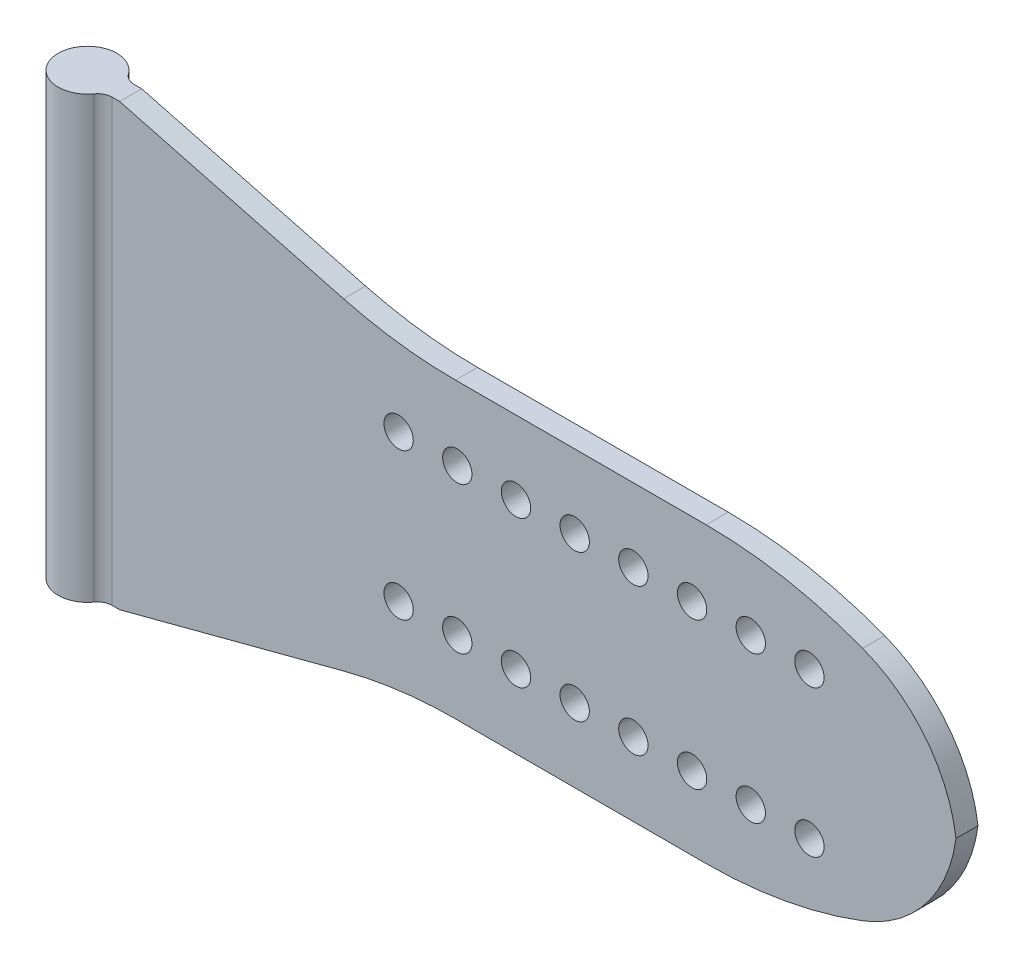
ISO-10303-21;
HEADER;
FILE_DESCRIPTION(('STEP AP214'),'2;1');
FILE_NAME('part.step','',(''),(''),'','','');
FILE_SCHEMA(('AUTOMOTIVE_DESIGN { 1 0 10303 214 1 1 1 1 }'));
ENDSEC;
DATA;
#1=APPLICATION_CONTEXT('core data for automotive mechanical design processes');
#2=APPLICATION_PROTOCOL_DEFINITION('international standard','automotive_design',2000,#1);
#3=PRODUCT_CONTEXT('',#1,'mechanical');
#4=PRODUCT('Part','Part','',(#3));
#5=PRODUCT_RELATED_PRODUCT_CATEGORY('part','',(#4));
#6=PRODUCT_DEFINITION_FORMATION('','',#4);
#7=PRODUCT_DEFINITION_CONTEXT('part definition',#1,'design');
#8=PRODUCT_DEFINITION('design','',#6,#7);
#9=PRODUCT_DEFINITION_SHAPE('','',#8);
#10=(LENGTH_UNIT() NAMED_UNIT(*) SI_UNIT(.MILLI.,.METRE.));
#11=(NAMED_UNIT(*) PLANE_ANGLE_UNIT() SI_UNIT($,.RADIAN.));
#12=(NAMED_UNIT(*) SI_UNIT($,.STERADIAN.) SOLID_ANGLE_UNIT());
#13=UNCERTAINTY_MEASURE_WITH_UNIT(LENGTH_MEASURE(1.E-05),#10,'distance_accuracy_value','');
#14=(GEOMETRIC_REPRESENTATION_CONTEXT(3) GLOBAL_UNCERTAINTY_ASSIGNED_CONTEXT((#13)) GLOBAL_UNIT_ASSIGNED_CONTEXT((#10,
#11,#12)) REPRESENTATION_CONTEXT('',''));
#15=CARTESIAN_POINT('',(0.,0.,0.));
#16=DIRECTION('',(0.,0.,1.));
#17=DIRECTION('',(1.,0.,0.));
#18=AXIS2_PLACEMENT_3D('',#15,#16,#17);
#19=CARTESIAN_POINT('',(0.,-15.,0.));
#20=DIRECTION('',(0.,1.,0.));
#21=DIRECTION('',(0.,0.,1.));
#22=AXIS2_PLACEMENT_3D('',#19,#20,#21);
#23=CYLINDRICAL_SURFACE('',#22,2.);
#24=DIRECTION('',(0.,1.,0.));
#25=VECTOR('',#24,1.);
#26=CARTESIAN_POINT('',(1.62446572413483,-15.,1.16666666666667));
#27=LINE('',#26,#25);
#28=CARTESIAN_POINT('',(1.62446572413483,-15.,1.16666666666667));
#29=VERTEX_POINT('',#28);
#30=CARTESIAN_POINT('',(1.62446572413483,15.,1.16666666666667));
#31=VERTEX_POINT('',#30);
#32=EDGE_CURVE('E198',#29,#31,#27,.T.);
#33=ORIENTED_EDGE('',*,*,#32,.T.);
#34=CARTESIAN_POINT('',(0.,15.,0.));
#35=DIRECTION('',(0.,1.,0.));
#36=DIRECTION('',(0.,0.,1.));
#37=AXIS2_PLACEMENT_3D('',#34,#35,#36);
#38=CIRCLE('',#37,2.);
#39=CARTESIAN_POINT('',(1.62446572413483,15.,-1.16666666666667));
#40=VERTEX_POINT('',#39);
#41=EDGE_CURVE('E178',#40,#31,#38,.T.);
#42=ORIENTED_EDGE('',*,*,#41,.F.);
#43=DIRECTION('',(0.,1.,0.));
#44=VECTOR('',#43,1.);
#45=CARTESIAN_POINT('',(1.62446572413483,-15.,-1.16666666666667));
#46=LINE('',#45,#44);
#47=CARTESIAN_POINT('',(1.62446572413483,-15.,-1.16666666666667));
#48=VERTEX_POINT('',#47);
#49=EDGE_CURVE('E156',#48,#40,#46,.T.);
#50=ORIENTED_EDGE('',*,*,#49,.F.);
#51=CARTESIAN_POINT('',(0.,-15.,0.));
#52=DIRECTION('',(0.,1.,0.));
#53=DIRECTION('',(0.,0.,1.));
#54=AXIS2_PLACEMENT_3D('',#51,#52,#53);
#55=CIRCLE('',#54,2.);
#56=EDGE_CURVE('E184',#48,#29,#55,.T.);
#57=ORIENTED_EDGE('',*,*,#56,.T.);
#58=EDGE_LOOP('',(#33,#42,#50,#57));
#59=FACE_BOUND('',#58,.T.);
#60=ADVANCED_FACE('F37',(#59),#23,.T.);
#61=CARTESIAN_POINT('',(2.43669858620224,-15.,-1.75));
#62=DIRECTION('',(0.,1.,0.));
#63=DIRECTION('',(0.,0.,1.));
#64=AXIS2_PLACEMENT_3D('',#61,#62,#63);
#65=CYLINDRICAL_SURFACE('',#64,1.);
#66=ORIENTED_EDGE('',*,*,#49,.T.);
#67=CARTESIAN_POINT('',(2.43669858620224,15.,-1.75));
#68=DIRECTION('',(0.,-1.,0.));
#69=DIRECTION('',(0.,0.,-1.));
#70=AXIS2_PLACEMENT_3D('',#67,#68,#69);
#71=CIRCLE('',#70,1.);
#72=CARTESIAN_POINT('',(2.43669858620224,15.,-0.75));
#73=VERTEX_POINT('',#72);
#74=EDGE_CURVE('E176',#73,#40,#71,.T.);
#75=ORIENTED_EDGE('',*,*,#74,.F.);
#76=DIRECTION('',(0.,1.,0.));
#77=VECTOR('',#76,1.);
#78=CARTESIAN_POINT('',(2.43669858620224,-15.,-0.75));
#79=LINE('',#78,#77);
#80=CARTESIAN_POINT('',(2.43669858620224,-15.,-0.75));
#81=VERTEX_POINT('',#80);
#82=EDGE_CURVE('E200',#81,#73,#79,.T.);
#83=ORIENTED_EDGE('',*,*,#82,.F.);
#84=CARTESIAN_POINT('',(2.43669858620224,-15.,-1.75));
#85=DIRECTION('',(0.,-1.,0.));
#86=DIRECTION('',(0.,0.,-1.));
#87=AXIS2_PLACEMENT_3D('',#84,#85,#86);
#88=CIRCLE('',#87,1.);
#89=EDGE_CURVE('E195',#81,#48,#88,.T.);
#90=ORIENTED_EDGE('',*,*,#89,.T.);
#91=EDGE_LOOP('',(#66,#75,#83,#90));
#92=FACE_BOUND('',#91,.T.);
#93=ADVANCED_FACE('F412',(#92),#65,.F.);
#94=CARTESIAN_POINT('',(2.43669858620224,-15.,-0.75));
#95=DIRECTION('',(0.,0.,-1.));
#96=DIRECTION('',(-1.,0.,0.));
#97=AXIS2_PLACEMENT_3D('',#94,#95,#96);
#98=PLANE('',#97);
#99=CARTESIAN_POINT('',(37.9526985862024,-5.00000000000008,-0.75));
#100=DIRECTION('',(0.,0.,-1.));
#101=DIRECTION('',(-1.,0.,0.));
#102=AXIS2_PLACEMENT_3D('',#99,#100,#101);
#103=CIRCLE('',#102,0.999999999999998);
#104=CARTESIAN_POINT('',(36.9526985862024,-5.00000000000008,-0.75));
#105=VERTEX_POINT('',#104);
#106=EDGE_CURVE('E373',#105,#105,#103,.T.);
#107=ORIENTED_EDGE('',*,*,#106,.F.);
#108=EDGE_LOOP('',(#107));
#109=FACE_BOUND('',#108,.T.);
#110=CARTESIAN_POINT('',(41.9526985862024,-5.00000000000006,-0.75));
#111=DIRECTION('',(0.,0.,-1.));
#112=DIRECTION('',(-1.,0.,0.));
#113=AXIS2_PLACEMENT_3D('',#110,#111,#112);
#114=CIRCLE('',#113,0.999999999999998);
#115=CARTESIAN_POINT('',(40.9526985862024,-5.00000000000006,-0.75));
#116=VERTEX_POINT('',#115);
#117=EDGE_CURVE('E370',#116,#116,#114,.T.);
#118=ORIENTED_EDGE('',*,*,#117,.F.);
#119=EDGE_LOOP('',(#118));
#120=FACE_BOUND('',#119,.T.);
#121=CARTESIAN_POINT('',(45.9526985862024,-5.00000000000003,-0.75));
#122=DIRECTION('',(0.,0.,-1.));
#123=DIRECTION('',(-1.,0.,0.));
#124=AXIS2_PLACEMENT_3D('',#121,#122,#123);
#125=CIRCLE('',#124,0.999999999999998);
#126=CARTESIAN_POINT('',(44.9526985862024,-5.00000000000003,-0.75));
#127=VERTEX_POINT('',#126);
#128=EDGE_CURVE('E367',#127,#127,#125,.T.);
#129=ORIENTED_EDGE('',*,*,#128,.F.);
#130=EDGE_LOOP('',(#129));
#131=FACE_BOUND('',#130,.T.);
#132=CARTESIAN_POINT('',(21.9526985862023,4.9999999999998,-0.75));
#133=DIRECTION('',(0.,0.,-1.));
#134=DIRECTION('',(-1.,0.,0.));
#135=AXIS2_PLACEMENT_3D('',#132,#133,#134);
#136=CIRCLE('',#135,0.999999999999998);
#137=CARTESIAN_POINT('',(20.9526985862023,4.9999999999998,-0.75));
#138=VERTEX_POINT('',#137);
#139=EDGE_CURVE('E364',#138,#138,#136,.T.);
#140=ORIENTED_EDGE('',*,*,#139,.F.);
#141=EDGE_LOOP('',(#140));
#142=FACE_BOUND('',#141,.T.);
#143=CARTESIAN_POINT('',(33.9526985862024,-5.00000000000011,-0.75));
#144=DIRECTION('',(0.,0.,-1.));
#145=DIRECTION('',(-1.,0.,0.));
#146=AXIS2_PLACEMENT_3D('',#143,#144,#145);
#147=CIRCLE('',#146,0.999999999999998);
#148=CARTESIAN_POINT('',(32.9526985862024,-5.00000000000011,-0.75));
#149=VERTEX_POINT('',#148);
#150=EDGE_CURVE('E361',#149,#149,#147,.T.);
#151=ORIENTED_EDGE('',*,*,#150,.F.);
#152=EDGE_LOOP('',(#151));
#153=FACE_BOUND('',#152,.T.);
#154=CARTESIAN_POINT('',(29.9526985862024,-5.00000000000014,-0.75));
#155=DIRECTION('',(0.,0.,-1.));
#156=DIRECTION('',(-1.,0.,0.));
#157=AXIS2_PLACEMENT_3D('',#154,#155,#156);
#158=CIRCLE('',#157,0.999999999999998);
#159=CARTESIAN_POINT('',(28.9526985862024,-5.00000000000014,-0.75));
#160=VERTEX_POINT('',#159);
#161=EDGE_CURVE('E358',#160,#160,#158,.T.);
#162=ORIENTED_EDGE('',*,*,#161,.F.);
#163=EDGE_LOOP('',(#162));
#164=FACE_BOUND('',#163,.T.);
#165=CARTESIAN_POINT('',(25.9526985862024,-5.00000000000017,-0.75));
#166=DIRECTION('',(0.,0.,-1.));
#167=DIRECTION('',(-1.,0.,0.));
#168=AXIS2_PLACEMENT_3D('',#165,#166,#167);
#169=CIRCLE('',#168,0.999999999999998);
#170=CARTESIAN_POINT('',(24.9526985862024,-5.00000000000017,-0.75));
#171=VERTEX_POINT('',#170);
#172=EDGE_CURVE('E355',#171,#171,#169,.T.);
#173=ORIENTED_EDGE('',*,*,#172,.F.);
#174=EDGE_LOOP('',(#173));
#175=FACE_BOUND('',#174,.T.);
#176=CARTESIAN_POINT('',(21.9526985862024,-5.0000000000002,-0.75));
#177=DIRECTION('',(0.,0.,-1.));
#178=DIRECTION('',(-1.,0.,0.));
#179=AXIS2_PLACEMENT_3D('',#176,#177,#178);
#180=CIRCLE('',#179,0.999999999999998);
#181=CARTESIAN_POINT('',(20.9526985862024,-5.0000000000002,-0.75));
#182=VERTEX_POINT('',#181);
#183=EDGE_CURVE('E352',#182,#182,#180,.T.);
#184=ORIENTED_EDGE('',*,*,#183,.F.);
#185=EDGE_LOOP('',(#184));
#186=FACE_BOUND('',#185,.T.);
#187=CARTESIAN_POINT('',(41.9526985862023,4.99999999999994,-0.75));
#188=DIRECTION('',(0.,0.,-1.));
#189=DIRECTION('',(-1.,0.,0.));
#190=AXIS2_PLACEMENT_3D('',#187,#188,#189);
#191=CIRCLE('',#190,0.999999999999998);
#192=CARTESIAN_POINT('',(40.9526985862022,4.99999999999994,-0.75));
#193=VERTEX_POINT('',#192);
#194=EDGE_CURVE('E349',#193,#193,#191,.T.);
#195=ORIENTED_EDGE('',*,*,#194,.F.);
#196=EDGE_LOOP('',(#195));
#197=FACE_BOUND('',#196,.T.);
#198=CARTESIAN_POINT('',(45.9526985862022,4.99999999999997,-0.75));
#199=DIRECTION('',(0.,0.,-1.));
#200=DIRECTION('',(-1.,0.,0.));
#201=AXIS2_PLACEMENT_3D('',#198,#199,#200);
#202=CIRCLE('',#201,0.999999999999998);
#203=CARTESIAN_POINT('',(44.9526985862022,4.99999999999997,-0.75));
#204=VERTEX_POINT('',#203);
#205=EDGE_CURVE('E346',#204,#204,#202,.T.);
#206=ORIENTED_EDGE('',*,*,#205,.F.);
#207=EDGE_LOOP('',(#206));
#208=FACE_BOUND('',#207,.T.);
#209=CARTESIAN_POINT('',(49.9526985862022,5.,-0.75));
#210=DIRECTION('',(0.,0.,-1.));
#211=DIRECTION('',(-1.,0.,0.));
#212=AXIS2_PLACEMENT_3D('',#209,#210,#211);
#213=CIRCLE('',#212,0.999999999999998);
#214=CARTESIAN_POINT('',(48.9526985862022,5.,-0.75));
#215=VERTEX_POINT('',#214);
#216=EDGE_CURVE('E343',#215,#215,#213,.T.);
#217=ORIENTED_EDGE('',*,*,#216,.F.);
#218=EDGE_LOOP('',(#217));
#219=FACE_BOUND('',#218,.T.);
#220=CARTESIAN_POINT('',(50.0266985862023,-1.30626791769696,-0.75));
#221=DIRECTION('',(0.,0.,-1.));
#222=DIRECTION('',(-1.,0.,0.));
#223=AXIS2_PLACEMENT_3D('',#220,#221,#222);
#224=CIRCLE('',#223,10.);
#225=CARTESIAN_POINT('',(53.581427156539,8.04059812345455,-0.75));
#226=VERTEX_POINT('',#225);
#227=CARTESIAN_POINT('',(59.9410147061974,0.,-0.75));
#228=VERTEX_POINT('',#227);
#229=EDGE_CURVE('E53',#226,#228,#224,.T.);
#230=ORIENTED_EDGE('',*,*,#229,.T.);
#231=CARTESIAN_POINT('',(50.0266985862023,1.30626791769696,-0.75));
#232=DIRECTION('',(0.,0.,-1.));
#233=DIRECTION('',(-1.,0.,0.));
#234=AXIS2_PLACEMENT_3D('',#231,#232,#233);
#235=CIRCLE('',#234,10.);
#236=CARTESIAN_POINT('',(53.581427156539,-8.04059812345455,-0.75));
#237=VERTEX_POINT('',#236);
#238=EDGE_CURVE('E46',#228,#237,#235,.T.);
#239=ORIENTED_EDGE('',*,*,#238,.T.);
#240=CARTESIAN_POINT('',(42.9172414455287,20.,-0.75));
#241=DIRECTION('',(0.,0.,-1.));
#242=DIRECTION('',(-1.,0.,0.));
#243=AXIS2_PLACEMENT_3D('',#240,#241,#242);
#244=CIRCLE('',#243,30.);
#245=CARTESIAN_POINT('',(42.9172414455287,-10.,-0.75));
#246=VERTEX_POINT('',#245);
#247=EDGE_CURVE('E222',#237,#246,#244,.T.);
#248=ORIENTED_EDGE('',*,*,#247,.T.);
#249=DIRECTION('',(1.,0.,0.));
#250=VECTOR('',#249,1.);
#251=CARTESIAN_POINT('',(2.43669858620224,-10.,-0.75));
#252=LINE('',#251,#250);
#253=CARTESIAN_POINT('',(25.8316256024831,-10.,-0.75));
#254=VERTEX_POINT('',#253);
#255=EDGE_CURVE('E341',#254,#246,#252,.T.);
#256=ORIENTED_EDGE('',*,*,#255,.F.);
#257=CARTESIAN_POINT('',(25.8316256024831,-40.,-0.75));
#258=DIRECTION('',(0.,0.,-1.));
#259=DIRECTION('',(-1.,0.,0.));
#260=AXIS2_PLACEMENT_3D('',#257,#258,#259);
#261=CIRCLE('',#260,30.);
#262=CARTESIAN_POINT('',(18.2013337280006,-10.9865781764679,-0.75));
#263=VERTEX_POINT('',#262);
#264=EDGE_CURVE('E233',#254,#263,#261,.F.);
#265=ORIENTED_EDGE('',*,*,#264,.T.);
#266=DIRECTION('',(0.967114060784402,0.254343062482749,0.));
#267=VECTOR('',#266,1.);
#268=CARTESIAN_POINT('',(2.46930254449253,-15.123973291003,-0.75));
#269=LINE('',#268,#267);
#270=CARTESIAN_POINT('',(2.94069858620225,-15.,-0.75));
#271=VERTEX_POINT('',#270);
#272=EDGE_CURVE('E320',#271,#263,#269,.T.);
#273=ORIENTED_EDGE('',*,*,#272,.F.);
#274=DIRECTION('',(-1.,0.,0.));
#275=VECTOR('',#274,1.);
#276=CARTESIAN_POINT('',(2.43669858620224,-15.,-0.75));
#277=LINE('',#276,#275);
#278=EDGE_CURVE('E193',#271,#81,#277,.T.);
#279=ORIENTED_EDGE('',*,*,#278,.T.);
#280=ORIENTED_EDGE('',*,*,#82,.T.);
#281=DIRECTION('',(-1.,0.,0.));
#282=VECTOR('',#281,1.);
#283=CARTESIAN_POINT('',(2.43669858620224,15.,-0.75));
#284=LINE('',#283,#282);
#285=CARTESIAN_POINT('',(2.94069858620223,15.,-0.75));
#286=VERTEX_POINT('',#285);
#287=EDGE_CURVE('E174',#286,#73,#284,.T.);
#288=ORIENTED_EDGE('',*,*,#287,.F.);
#289=DIRECTION('',(-0.967114060784402,0.254343062482749,0.));
#290=VECTOR('',#289,1.);
#291=CARTESIAN_POINT('',(9.84866510419349,13.1832614880099,-0.75));
#292=LINE('',#291,#290);
#293=CARTESIAN_POINT('',(18.2013337280006,10.9865781764679,-0.75));
#294=VERTEX_POINT('',#293);
#295=EDGE_CURVE('E151',#294,#286,#292,.T.);
#296=ORIENTED_EDGE('',*,*,#295,.F.);
#297=CARTESIAN_POINT('',(25.8316256024831,40.,-0.75));
#298=DIRECTION('',(0.,0.,-1.));
#299=DIRECTION('',(-1.,0.,0.));
#300=AXIS2_PLACEMENT_3D('',#297,#298,#299);
#301=CIRCLE('',#300,30.);
#302=CARTESIAN_POINT('',(25.8316256024831,9.99999999999999,-0.75));
#303=VERTEX_POINT('',#302);
#304=EDGE_CURVE('E236',#294,#303,#301,.F.);
#305=ORIENTED_EDGE('',*,*,#304,.T.);
#306=DIRECTION('',(-1.,0.,0.));
#307=VECTOR('',#306,1.);
#308=CARTESIAN_POINT('',(2.43669858620223,9.99999999999998,-0.75));
#309=LINE('',#308,#307);
#310=CARTESIAN_POINT('',(42.9172414455287,10.,-0.75));
#311=VERTEX_POINT('',#310);
#312=EDGE_CURVE('E323',#311,#303,#309,.T.);
#313=ORIENTED_EDGE('',*,*,#312,.F.);
#314=CARTESIAN_POINT('',(42.9172414455287,-20.,-0.75));
#315=DIRECTION('',(0.,0.,-1.));
#316=DIRECTION('',(-1.,0.,0.));
#317=AXIS2_PLACEMENT_3D('',#314,#315,#316);
#318=CIRCLE('',#317,30.);
#319=EDGE_CURVE('E220',#311,#226,#318,.T.);
#320=ORIENTED_EDGE('',*,*,#319,.T.);
#321=EDGE_LOOP('',(#230,#239,#248,#256,#265,#273,#279,#280,#288,#296,#305,#313,#320));
#322=FACE_BOUND('',#321,.T.);
#323=CARTESIAN_POINT('',(37.9526985862023,4.99999999999991,-0.75));
#324=DIRECTION('',(0.,0.,-1.));
#325=DIRECTION('',(-1.,0.,0.));
#326=AXIS2_PLACEMENT_3D('',#323,#324,#325);
#327=CIRCLE('',#326,0.999999999999998);
#328=CARTESIAN_POINT('',(36.9526985862023,4.99999999999991,-0.75));
#329=VERTEX_POINT('',#328);
#330=EDGE_CURVE('E338',#329,#329,#327,.T.);
#331=ORIENTED_EDGE('',*,*,#330,.F.);
#332=EDGE_LOOP('',(#331));
#333=FACE_BOUND('',#332,.T.);
#334=CARTESIAN_POINT('',(33.9526985862023,4.99999999999989,-0.75));
#335=DIRECTION('',(0.,0.,-1.));
#336=DIRECTION('',(-1.,0.,0.));
#337=AXIS2_PLACEMENT_3D('',#334,#335,#336);
#338=CIRCLE('',#337,0.999999999999998);
#339=CARTESIAN_POINT('',(32.9526985862023,4.99999999999989,-0.75));
#340=VERTEX_POINT('',#339);
#341=EDGE_CURVE('E335',#340,#340,#338,.T.);
#342=ORIENTED_EDGE('',*,*,#341,.F.);
#343=EDGE_LOOP('',(#342));
#344=FACE_BOUND('',#343,.T.);
#345=CARTESIAN_POINT('',(29.9526985862023,4.99999999999986,-0.75));
#346=DIRECTION('',(0.,0.,-1.));
#347=DIRECTION('',(-1.,0.,0.));
#348=AXIS2_PLACEMENT_3D('',#345,#346,#347);
#349=CIRCLE('',#348,0.999999999999998);
#350=CARTESIAN_POINT('',(28.9526985862023,4.99999999999986,-0.75));
#351=VERTEX_POINT('',#350);
#352=EDGE_CURVE('E332',#351,#351,#349,.T.);
#353=ORIENTED_EDGE('',*,*,#352,.F.);
#354=EDGE_LOOP('',(#353));
#355=FACE_BOUND('',#354,.T.);
#356=CARTESIAN_POINT('',(25.9526985862023,4.99999999999983,-0.75));
#357=DIRECTION('',(0.,0.,-1.));
#358=DIRECTION('',(-1.,0.,0.));
#359=AXIS2_PLACEMENT_3D('',#356,#357,#358);
#360=CIRCLE('',#359,0.999999999999998);
#361=CARTESIAN_POINT('',(24.9526985862023,4.99999999999983,-0.75));
#362=VERTEX_POINT('',#361);
#363=EDGE_CURVE('E329',#362,#362,#360,.T.);
#364=ORIENTED_EDGE('',*,*,#363,.F.);
#365=EDGE_LOOP('',(#364));
#366=FACE_BOUND('',#365,.T.);
#367=CARTESIAN_POINT('',(49.9526985862023,-5.,-0.75));
#368=DIRECTION('',(0.,0.,-1.));
#369=DIRECTION('',(-1.,0.,0.));
#370=AXIS2_PLACEMENT_3D('',#367,#368,#369);
#371=CIRCLE('',#370,0.999999999999998);
#372=CARTESIAN_POINT('',(48.9526985862023,-5.,-0.75));
#373=VERTEX_POINT('',#372);
#374=EDGE_CURVE('E326',#373,#373,#371,.T.);
#375=ORIENTED_EDGE('',*,*,#374,.F.);
#376=EDGE_LOOP('',(#375));
#377=FACE_BOUND('',#376,.T.);
#378=ADVANCED_FACE('F248',(#109,#120,#131,#142,#153,#164,#175,#186,#197,#208,#219,#322,#333,
#344,#355,#366,#377),#98,.T.);
#379=CARTESIAN_POINT('',(60.0266985862022,-15.,0.75));
#380=DIRECTION('',(0.,0.,1.));
#381=DIRECTION('',(1.,0.,0.));
#382=AXIS2_PLACEMENT_3D('',#379,#380,#381);
#383=PLANE('',#382);
#384=CARTESIAN_POINT('',(37.9526985862024,-5.00000000000008,0.75));
#385=DIRECTION('',(0.,0.,1.));
#386=DIRECTION('',(1.,0.,0.));
#387=AXIS2_PLACEMENT_3D('',#384,#385,#386);
#388=CIRCLE('',#387,0.999999999999998);
#389=CARTESIAN_POINT('',(38.9526985862024,-5.00000000000008,0.75));
#390=VERTEX_POINT('',#389);
#391=EDGE_CURVE('E275',#390,#390,#388,.T.);
#392=ORIENTED_EDGE('',*,*,#391,.F.);
#393=EDGE_LOOP('',(#392));
#394=FACE_BOUND('',#393,.T.);
#395=CARTESIAN_POINT('',(41.9526985862024,-5.00000000000006,0.75));
#396=DIRECTION('',(0.,0.,1.));
#397=DIRECTION('',(1.,0.,0.));
#398=AXIS2_PLACEMENT_3D('',#395,#396,#397);
#399=CIRCLE('',#398,0.999999999999998);
#400=CARTESIAN_POINT('',(42.9526985862024,-5.00000000000006,0.75));
#401=VERTEX_POINT('',#400);
#402=EDGE_CURVE('E281',#401,#401,#399,.T.);
#403=ORIENTED_EDGE('',*,*,#402,.F.);
#404=EDGE_LOOP('',(#403));
#405=FACE_BOUND('',#404,.T.);
#406=CARTESIAN_POINT('',(45.9526985862024,-5.00000000000003,0.75));
#407=DIRECTION('',(0.,0.,1.));
#408=DIRECTION('',(1.,0.,0.));
#409=AXIS2_PLACEMENT_3D('',#406,#407,#408);
#410=CIRCLE('',#409,0.999999999999998);
#411=CARTESIAN_POINT('',(46.9526985862024,-5.00000000000003,0.75));
#412=VERTEX_POINT('',#411);
#413=EDGE_CURVE('E284',#412,#412,#410,.T.);
#414=ORIENTED_EDGE('',*,*,#413,.F.);
#415=EDGE_LOOP('',(#414));
#416=FACE_BOUND('',#415,.T.);
#417=CARTESIAN_POINT('',(21.9526985862023,4.9999999999998,0.75));
#418=DIRECTION('',(0.,0.,1.));
#419=DIRECTION('',(1.,0.,0.));
#420=AXIS2_PLACEMENT_3D('',#417,#418,#419);
#421=CIRCLE('',#420,0.999999999999998);
#422=CARTESIAN_POINT('',(22.9526985862023,4.9999999999998,0.75));
#423=VERTEX_POINT('',#422);
#424=EDGE_CURVE('E287',#423,#423,#421,.T.);
#425=ORIENTED_EDGE('',*,*,#424,.F.);
#426=EDGE_LOOP('',(#425));
#427=FACE_BOUND('',#426,.T.);
#428=CARTESIAN_POINT('',(33.9526985862024,-5.00000000000011,0.75));
#429=DIRECTION('',(0.,0.,1.));
#430=DIRECTION('',(1.,0.,0.));
#431=AXIS2_PLACEMENT_3D('',#428,#429,#430);
#432=CIRCLE('',#431,0.999999999999998);
#433=CARTESIAN_POINT('',(34.9526985862024,-5.00000000000011,0.75));
#434=VERTEX_POINT('',#433);
#435=EDGE_CURVE('E272',#434,#434,#432,.T.);
#436=ORIENTED_EDGE('',*,*,#435,.F.);
#437=EDGE_LOOP('',(#436));
#438=FACE_BOUND('',#437,.T.);
#439=CARTESIAN_POINT('',(29.9526985862024,-5.00000000000014,0.75));
#440=DIRECTION('',(0.,0.,1.));
#441=DIRECTION('',(1.,0.,0.));
#442=AXIS2_PLACEMENT_3D('',#439,#440,#441);
#443=CIRCLE('',#442,0.999999999999998);
#444=CARTESIAN_POINT('',(30.9526985862024,-5.00000000000014,0.75));
#445=VERTEX_POINT('',#444);
#446=EDGE_CURVE('E276',#445,#445,#443,.T.);
#447=ORIENTED_EDGE('',*,*,#446,.F.);
#448=EDGE_LOOP('',(#447));
#449=FACE_BOUND('',#448,.T.);
#450=CARTESIAN_POINT('',(25.9526985862024,-5.00000000000017,0.75));
#451=DIRECTION('',(0.,0.,1.));
#452=DIRECTION('',(1.,0.,0.));
#453=AXIS2_PLACEMENT_3D('',#450,#451,#452);
#454=CIRCLE('',#453,0.999999999999998);
#455=CARTESIAN_POINT('',(26.9526985862024,-5.00000000000017,0.75));
#456=VERTEX_POINT('',#455);
#457=EDGE_CURVE('E269',#456,#456,#454,.T.);
#458=ORIENTED_EDGE('',*,*,#457,.F.);
#459=EDGE_LOOP('',(#458));
#460=FACE_BOUND('',#459,.T.);
#461=CARTESIAN_POINT('',(21.9526985862024,-5.0000000000002,0.75));
#462=DIRECTION('',(0.,0.,1.));
#463=DIRECTION('',(1.,0.,0.));
#464=AXIS2_PLACEMENT_3D('',#461,#462,#463);
#465=CIRCLE('',#464,0.999999999999998);
#466=CARTESIAN_POINT('',(22.9526985862024,-5.0000000000002,0.75));
#467=VERTEX_POINT('',#466);
#468=EDGE_CURVE('E264',#467,#467,#465,.T.);
#469=ORIENTED_EDGE('',*,*,#468,.F.);
#470=EDGE_LOOP('',(#469));
#471=FACE_BOUND('',#470,.T.);
#472=CARTESIAN_POINT('',(41.9526985862023,4.99999999999994,0.75));
#473=DIRECTION('',(0.,0.,1.));
#474=DIRECTION('',(1.,0.,0.));
#475=AXIS2_PLACEMENT_3D('',#472,#473,#474);
#476=CIRCLE('',#475,0.999999999999998);
#477=CARTESIAN_POINT('',(42.9526985862023,4.99999999999994,0.75));
#478=VERTEX_POINT('',#477);
#479=EDGE_CURVE('E296',#478,#478,#476,.T.);
#480=ORIENTED_EDGE('',*,*,#479,.F.);
#481=EDGE_LOOP('',(#480));
#482=FACE_BOUND('',#481,.T.);
#483=CARTESIAN_POINT('',(45.9526985862022,4.99999999999997,0.75));
#484=DIRECTION('',(0.,0.,1.));
#485=DIRECTION('',(1.,0.,0.));
#486=AXIS2_PLACEMENT_3D('',#483,#484,#485);
#487=CIRCLE('',#486,0.999999999999998);
#488=CARTESIAN_POINT('',(46.9526985862022,4.99999999999997,0.75));
#489=VERTEX_POINT('',#488);
#490=EDGE_CURVE('E305',#489,#489,#487,.T.);
#491=ORIENTED_EDGE('',*,*,#490,.F.);
#492=EDGE_LOOP('',(#491));
#493=FACE_BOUND('',#492,.T.);
#494=CARTESIAN_POINT('',(49.9526985862022,5.,0.75));
#495=DIRECTION('',(0.,0.,1.));
#496=DIRECTION('',(1.,0.,0.));
#497=AXIS2_PLACEMENT_3D('',#494,#495,#496);
#498=CIRCLE('',#497,0.999999999999998);
#499=CARTESIAN_POINT('',(50.9526985862022,5.,0.75));
#500=VERTEX_POINT('',#499);
#501=EDGE_CURVE('E308',#500,#500,#498,.T.);
#502=ORIENTED_EDGE('',*,*,#501,.F.);
#503=EDGE_LOOP('',(#502));
#504=FACE_BOUND('',#503,.T.);
#505=CARTESIAN_POINT('',(42.9172414455287,20.,0.75));
#506=DIRECTION('',(0.,0.,1.));
#507=DIRECTION('',(1.,0.,0.));
#508=AXIS2_PLACEMENT_3D('',#505,#506,#507);
#509=CIRCLE('',#508,30.);
#510=CARTESIAN_POINT('',(42.9172414455287,-10.,0.75));
#511=VERTEX_POINT('',#510);
#512=CARTESIAN_POINT('',(53.581427156539,-8.04059812345455,0.75));
#513=VERTEX_POINT('',#512);
#514=EDGE_CURVE('E218',#511,#513,#509,.T.);
#515=ORIENTED_EDGE('',*,*,#514,.T.);
#516=CARTESIAN_POINT('',(50.0266985862023,1.30626791769696,0.75));
#517=DIRECTION('',(0.,0.,1.));
#518=DIRECTION('',(1.,0.,0.));
#519=AXIS2_PLACEMENT_3D('',#516,#517,#518);
#520=CIRCLE('',#519,10.);
#521=CARTESIAN_POINT('',(59.9410147061974,0.,0.75));
#522=VERTEX_POINT('',#521);
#523=EDGE_CURVE('E243',#513,#522,#520,.T.);
#524=ORIENTED_EDGE('',*,*,#523,.T.);
#525=CARTESIAN_POINT('',(50.0266985862023,-1.30626791769696,0.749999999999999));
#526=DIRECTION('',(0.,0.,1.));
#527=DIRECTION('',(1.,0.,0.));
#528=AXIS2_PLACEMENT_3D('',#525,#526,#527);
#529=CIRCLE('',#528,10.);
#530=CARTESIAN_POINT('',(53.581427156539,8.04059812345455,0.749999999999999));
#531=VERTEX_POINT('',#530);
#532=EDGE_CURVE('E241',#522,#531,#529,.T.);
#533=ORIENTED_EDGE('',*,*,#532,.T.);
#534=CARTESIAN_POINT('',(42.9172414455287,-20.,0.749999999999999));
#535=DIRECTION('',(0.,0.,1.));
#536=DIRECTION('',(1.,0.,0.));
#537=AXIS2_PLACEMENT_3D('',#534,#535,#536);
#538=CIRCLE('',#537,30.);
#539=CARTESIAN_POINT('',(42.9172414455287,10.,0.75));
#540=VERTEX_POINT('',#539);
#541=EDGE_CURVE('E216',#531,#540,#538,.T.);
#542=ORIENTED_EDGE('',*,*,#541,.T.);
#543=DIRECTION('',(1.,0.,0.));
#544=VECTOR('',#543,1.);
#545=CARTESIAN_POINT('',(49.9526985862022,10.,0.75));
#546=LINE('',#545,#544);
#547=CARTESIAN_POINT('',(25.8316256024831,9.99999999999999,0.75));
#548=VERTEX_POINT('',#547);
#549=EDGE_CURVE('E166',#548,#540,#546,.T.);
#550=ORIENTED_EDGE('',*,*,#549,.F.);
#551=CARTESIAN_POINT('',(25.8316256024831,40.,0.75));
#552=DIRECTION('',(0.,0.,1.));
#553=DIRECTION('',(1.,0.,0.));
#554=AXIS2_PLACEMENT_3D('',#551,#552,#553);
#555=CIRCLE('',#554,30.);
#556=CARTESIAN_POINT('',(18.2013337280006,10.9865781764679,0.75));
#557=VERTEX_POINT('',#556);
#558=EDGE_CURVE('E165',#548,#557,#555,.F.);
#559=ORIENTED_EDGE('',*,*,#558,.T.);
#560=DIRECTION('',(0.967114060784402,-0.254343062482749,0.));
#561=VECTOR('',#560,1.);
#562=CARTESIAN_POINT('',(21.9526985862022,9.99999999999999,0.75));
#563=LINE('',#562,#561);
#564=CARTESIAN_POINT('',(2.94069858620224,15.,0.75));
#565=VERTEX_POINT('',#564);
#566=EDGE_CURVE('E148',#565,#557,#563,.T.);
#567=ORIENTED_EDGE('',*,*,#566,.F.);
#568=DIRECTION('',(1.,0.,0.));
#569=VECTOR('',#568,1.);
#570=CARTESIAN_POINT('',(60.0266985862022,15.,0.75));
#571=LINE('',#570,#569);
#572=CARTESIAN_POINT('',(2.43669858620224,15.,0.75));
#573=VERTEX_POINT('',#572);
#574=EDGE_CURVE('E163',#573,#565,#571,.T.);
#575=ORIENTED_EDGE('',*,*,#574,.F.);
#576=DIRECTION('',(0.,1.,0.));
#577=VECTOR('',#576,1.);
#578=CARTESIAN_POINT('',(2.43669858620224,-15.,0.75));
#579=LINE('',#578,#577);
#580=CARTESIAN_POINT('',(2.43669858620224,-15.,0.75));
#581=VERTEX_POINT('',#580);
#582=EDGE_CURVE('E203',#581,#573,#579,.T.);
#583=ORIENTED_EDGE('',*,*,#582,.F.);
#584=DIRECTION('',(1.,0.,0.));
#585=VECTOR('',#584,1.);
#586=CARTESIAN_POINT('',(60.0266985862022,-15.,0.75));
#587=LINE('',#586,#585);
#588=CARTESIAN_POINT('',(2.94069858620226,-15.,0.75));
#589=VERTEX_POINT('',#588);
#590=EDGE_CURVE('E190',#581,#589,#587,.T.);
#591=ORIENTED_EDGE('',*,*,#590,.T.);
#592=DIRECTION('',(-0.967114060784402,-0.254343062482749,0.));
#593=VECTOR('',#592,1.);
#594=CARTESIAN_POINT('',(21.9526985862022,-10.,0.75));
#595=LINE('',#594,#593);
#596=CARTESIAN_POINT('',(18.2013337280006,-10.9865781764679,0.75));
#597=VERTEX_POINT('',#596);
#598=EDGE_CURVE('E167',#597,#589,#595,.T.);
#599=ORIENTED_EDGE('',*,*,#598,.F.);
#600=CARTESIAN_POINT('',(25.8316256024831,-40.,0.749999999999999));
#601=DIRECTION('',(0.,0.,1.));
#602=DIRECTION('',(1.,0.,0.));
#603=AXIS2_PLACEMENT_3D('',#600,#601,#602);
#604=CIRCLE('',#603,30.);
#605=CARTESIAN_POINT('',(25.8316256024831,-10.,0.75));
#606=VERTEX_POINT('',#605);
#607=EDGE_CURVE('E231',#597,#606,#604,.F.);
#608=ORIENTED_EDGE('',*,*,#607,.T.);
#609=DIRECTION('',(-1.,0.,0.));
#610=VECTOR('',#609,1.);
#611=CARTESIAN_POINT('',(49.9526985862022,-10.,0.75));
#612=LINE('',#611,#610);
#613=EDGE_CURVE('E311',#511,#606,#612,.T.);
#614=ORIENTED_EDGE('',*,*,#613,.F.);
#615=EDGE_LOOP('',(#515,#524,#533,#542,#550,#559,#567,#575,#583,#591,#599,#608,#614));
#616=FACE_BOUND('',#615,.T.);
#617=CARTESIAN_POINT('',(37.9526985862023,4.99999999999991,0.75));
#618=DIRECTION('',(0.,0.,1.));
#619=DIRECTION('',(1.,0.,0.));
#620=AXIS2_PLACEMENT_3D('',#617,#618,#619);
#621=CIRCLE('',#620,0.999999999999998);
#622=CARTESIAN_POINT('',(38.9526985862023,4.99999999999991,0.75));
#623=VERTEX_POINT('',#622);
#624=EDGE_CURVE('E293',#623,#623,#621,.T.);
#625=ORIENTED_EDGE('',*,*,#624,.F.);
#626=EDGE_LOOP('',(#625));
#627=FACE_BOUND('',#626,.T.);
#628=CARTESIAN_POINT('',(33.9526985862023,4.99999999999989,0.75));
#629=DIRECTION('',(0.,0.,1.));
#630=DIRECTION('',(1.,0.,0.));
#631=AXIS2_PLACEMENT_3D('',#628,#629,#630);
#632=CIRCLE('',#631,0.999999999999998);
#633=CARTESIAN_POINT('',(34.9526985862023,4.99999999999989,0.75));
#634=VERTEX_POINT('',#633);
#635=EDGE_CURVE('E297',#634,#634,#632,.T.);
#636=ORIENTED_EDGE('',*,*,#635,.F.);
#637=EDGE_LOOP('',(#636));
#638=FACE_BOUND('',#637,.T.);
#639=CARTESIAN_POINT('',(29.9526985862023,4.99999999999986,0.75));
#640=DIRECTION('',(0.,0.,1.));
#641=DIRECTION('',(1.,0.,0.));
#642=AXIS2_PLACEMENT_3D('',#639,#640,#641);
#643=CIRCLE('',#642,0.999999999999998);
#644=CARTESIAN_POINT('',(30.9526985862023,4.99999999999986,0.75));
#645=VERTEX_POINT('',#644);
#646=EDGE_CURVE('E300',#645,#645,#643,.T.);
#647=ORIENTED_EDGE('',*,*,#646,.F.);
#648=EDGE_LOOP('',(#647));
#649=FACE_BOUND('',#648,.T.);
#650=CARTESIAN_POINT('',(25.9526985862023,4.99999999999983,0.75));
#651=DIRECTION('',(0.,0.,1.));
#652=DIRECTION('',(1.,0.,0.));
#653=AXIS2_PLACEMENT_3D('',#650,#651,#652);
#654=CIRCLE('',#653,0.999999999999998);
#655=CARTESIAN_POINT('',(26.9526985862023,4.99999999999983,0.75));
#656=VERTEX_POINT('',#655);
#657=EDGE_CURVE('E290',#656,#656,#654,.T.);
#658=ORIENTED_EDGE('',*,*,#657,.F.);
#659=EDGE_LOOP('',(#658));
#660=FACE_BOUND('',#659,.T.);
#661=CARTESIAN_POINT('',(49.9526985862023,-5.,0.75));
#662=DIRECTION('',(0.,0.,1.));
#663=DIRECTION('',(1.,0.,0.));
#664=AXIS2_PLACEMENT_3D('',#661,#662,#663);
#665=CIRCLE('',#664,0.999999999999998);
#666=CARTESIAN_POINT('',(50.9526985862023,-5.,0.75));
#667=VERTEX_POINT('',#666);
#668=EDGE_CURVE('E262',#667,#667,#665,.T.);
#669=ORIENTED_EDGE('',*,*,#668,.F.);
#670=EDGE_LOOP('',(#669));
#671=FACE_BOUND('',#670,.T.);
#672=ADVANCED_FACE('F161',(#394,#405,#416,#427,#438,#449,#460,#471,#482,#493,#504,#616,#627,
#638,#649,#660,#671),#383,.T.);
#673=CARTESIAN_POINT('',(2.43669858620224,-15.,1.75));
#674=DIRECTION('',(0.,1.,0.));
#675=DIRECTION('',(0.,0.,1.));
#676=AXIS2_PLACEMENT_3D('',#673,#674,#675);
#677=CYLINDRICAL_SURFACE('',#676,1.);
#678=ORIENTED_EDGE('',*,*,#582,.T.);
#679=CARTESIAN_POINT('',(2.43669858620224,15.,1.75));
#680=DIRECTION('',(0.,-1.,0.));
#681=DIRECTION('',(0.,0.,1.));
#682=AXIS2_PLACEMENT_3D('',#679,#680,#681);
#683=CIRCLE('',#682,1.);
#684=EDGE_CURVE('E173',#31,#573,#683,.T.);
#685=ORIENTED_EDGE('',*,*,#684,.F.);
#686=ORIENTED_EDGE('',*,*,#32,.F.);
#687=CARTESIAN_POINT('',(2.43669858620224,-15.,1.75));
#688=DIRECTION('',(0.,-1.,0.));
#689=DIRECTION('',(0.,0.,1.));
#690=AXIS2_PLACEMENT_3D('',#687,#688,#689);
#691=CIRCLE('',#690,1.);
#692=EDGE_CURVE('E187',#29,#581,#691,.T.);
#693=ORIENTED_EDGE('',*,*,#692,.T.);
#694=EDGE_LOOP('',(#678,#685,#686,#693));
#695=FACE_BOUND('',#694,.T.);
#696=ADVANCED_FACE('F381',(#695),#677,.F.);
#697=CARTESIAN_POINT('',(0.,-15.,0.));
#698=DIRECTION('',(0.,1.,0.));
#699=DIRECTION('',(0.,0.,1.));
#700=AXIS2_PLACEMENT_3D('',#697,#698,#699);
#701=PLANE('',#700);
#702=ORIENTED_EDGE('',*,*,#278,.F.);
#703=DIRECTION('',(0.,0.,1.));
#704=VECTOR('',#703,1.);
#705=CARTESIAN_POINT('',(2.94069858620228,-15.,0.));
#706=LINE('',#705,#704);
#707=EDGE_CURVE('E155',#271,#589,#706,.T.);
#708=ORIENTED_EDGE('',*,*,#707,.T.);
#709=ORIENTED_EDGE('',*,*,#590,.F.);
#710=ORIENTED_EDGE('',*,*,#692,.F.);
#711=ORIENTED_EDGE('',*,*,#56,.F.);
#712=ORIENTED_EDGE('',*,*,#89,.F.);
#713=EDGE_LOOP('',(#702,#708,#709,#710,#711,#712));
#714=FACE_BOUND('',#713,.T.);
#715=ADVANCED_FACE('F386',(#714),#701,.F.);
#716=CARTESIAN_POINT('',(0.,15.,0.));
#717=DIRECTION('',(0.,1.,0.));
#718=DIRECTION('',(0.,0.,1.));
#719=AXIS2_PLACEMENT_3D('',#716,#717,#718);
#720=PLANE('',#719);
#721=DIRECTION('',(0.,0.,1.));
#722=VECTOR('',#721,1.);
#723=CARTESIAN_POINT('',(2.94069858620223,15.,0.));
#724=LINE('',#723,#722);
#725=EDGE_CURVE('E145',#286,#565,#724,.T.);
#726=ORIENTED_EDGE('',*,*,#725,.F.);
#727=ORIENTED_EDGE('',*,*,#287,.T.);
#728=ORIENTED_EDGE('',*,*,#74,.T.);
#729=ORIENTED_EDGE('',*,*,#41,.T.);
#730=ORIENTED_EDGE('',*,*,#684,.T.);
#731=ORIENTED_EDGE('',*,*,#574,.T.);
#732=EDGE_LOOP('',(#726,#727,#728,#729,#730,#731));
#733=FACE_BOUND('',#732,.T.);
#734=ADVANCED_FACE('F170',(#733),#720,.T.);
#735=CARTESIAN_POINT('',(49.9526985862022,10.,-2.));
#736=DIRECTION('',(0.,-1.,0.));
#737=DIRECTION('',(1.,0.,0.));
#738=AXIS2_PLACEMENT_3D('',#735,#736,#737);
#739=PLANE('',#738);
#740=ORIENTED_EDGE('',*,*,#549,.T.);
#741=DIRECTION('',(0.,0.,1.));
#742=VECTOR('',#741,1.);
#743=CARTESIAN_POINT('',(42.9172414455287,10.,-2.));
#744=LINE('',#743,#742);
#745=EDGE_CURVE('E227',#540,#311,#744,.F.);
#746=ORIENTED_EDGE('',*,*,#745,.T.);
#747=ORIENTED_EDGE('',*,*,#312,.T.);
#748=DIRECTION('',(0.,0.,1.));
#749=VECTOR('',#748,1.);
#750=CARTESIAN_POINT('',(25.8316256024831,9.99999999999999,0.75));
#751=LINE('',#750,#749);
#752=EDGE_CURVE('E224',#303,#548,#751,.T.);
#753=ORIENTED_EDGE('',*,*,#752,.T.);
#754=EDGE_LOOP('',(#740,#746,#747,#753));
#755=FACE_BOUND('',#754,.T.);
#756=ADVANCED_FACE('F589',(#755),#739,.F.);
#757=CARTESIAN_POINT('',(21.9526985862022,9.99999999999999,-2.));
#758=DIRECTION('',(-0.254343062482749,-0.967114060784402,0.));
#759=DIRECTION('',(0.967114060784402,-0.254343062482749,0.));
#760=AXIS2_PLACEMENT_3D('',#757,#758,#759);
#761=PLANE('',#760);
#762=ORIENTED_EDGE('',*,*,#566,.T.);
#763=DIRECTION('',(0.,0.,1.));
#764=VECTOR('',#763,1.);
#765=CARTESIAN_POINT('',(18.2013337280006,10.9865781764679,-0.75));
#766=LINE('',#765,#764);
#767=EDGE_CURVE('E229',#557,#294,#766,.F.);
#768=ORIENTED_EDGE('',*,*,#767,.T.);
#769=ORIENTED_EDGE('',*,*,#295,.T.);
#770=ORIENTED_EDGE('',*,*,#725,.T.);
#771=EDGE_LOOP('',(#762,#768,#769,#770));
#772=FACE_BOUND('',#771,.T.);
#773=ADVANCED_FACE('F147',(#772),#761,.F.);
#774=CARTESIAN_POINT('',(21.9526985862022,-10.,-2.));
#775=DIRECTION('',(-0.254343062482749,0.967114060784402,0.));
#776=DIRECTION('',(-0.967114060784402,-0.254343062482749,0.));
#777=AXIS2_PLACEMENT_3D('',#774,#775,#776);
#778=PLANE('',#777);
#779=ORIENTED_EDGE('',*,*,#272,.T.);
#780=DIRECTION('',(0.,0.,1.));
#781=VECTOR('',#780,1.);
#782=CARTESIAN_POINT('',(18.2013337280006,-10.9865781764679,0.749999999999999));
#783=LINE('',#782,#781);
#784=EDGE_CURVE('E208',#263,#597,#783,.T.);
#785=ORIENTED_EDGE('',*,*,#784,.T.);
#786=ORIENTED_EDGE('',*,*,#598,.T.);
#787=ORIENTED_EDGE('',*,*,#707,.F.);
#788=EDGE_LOOP('',(#779,#785,#786,#787));
#789=FACE_BOUND('',#788,.T.);
#790=ADVANCED_FACE('F390',(#789),#778,.F.);
#791=CARTESIAN_POINT('',(49.9526985862022,-10.,-2.));
#792=DIRECTION('',(0.,1.,0.));
#793=DIRECTION('',(-1.,0.,0.));
#794=AXIS2_PLACEMENT_3D('',#791,#792,#793);
#795=PLANE('',#794);
#796=ORIENTED_EDGE('',*,*,#613,.T.);
#797=DIRECTION('',(0.,0.,1.));
#798=VECTOR('',#797,1.);
#799=CARTESIAN_POINT('',(25.8316256024831,-10.,-0.75));
#800=LINE('',#799,#798);
#801=EDGE_CURVE('E214',#606,#254,#800,.F.);
#802=ORIENTED_EDGE('',*,*,#801,.T.);
#803=ORIENTED_EDGE('',*,*,#255,.T.);
#804=DIRECTION('',(0.,0.,1.));
#805=VECTOR('',#804,1.);
#806=CARTESIAN_POINT('',(42.9172414455287,-10.,-2.));
#807=LINE('',#806,#805);
#808=EDGE_CURVE('E211',#246,#511,#807,.T.);
#809=ORIENTED_EDGE('',*,*,#808,.T.);
#810=EDGE_LOOP('',(#796,#802,#803,#809));
#811=FACE_BOUND('',#810,.T.);
#812=ADVANCED_FACE('F398',(#811),#795,.F.);
#813=CARTESIAN_POINT('',(49.9526985862023,-5.,-2.));
#814=DIRECTION('',(0.,0.,1.));
#815=DIRECTION('',(1.,0.,0.));
#816=AXIS2_PLACEMENT_3D('',#813,#814,#815);
#817=CYLINDRICAL_SURFACE('',#816,0.999999999999998);
#818=ORIENTED_EDGE('',*,*,#374,.T.);
#819=EDGE_LOOP('',(#818));
#820=FACE_BOUND('',#819,.T.);
#821=ORIENTED_EDGE('',*,*,#668,.T.);
#822=EDGE_LOOP('',(#821));
#823=FACE_BOUND('',#822,.T.);
#824=ADVANCED_FACE('F400',(#820,#823),#817,.F.);
#825=CARTESIAN_POINT('',(25.9526985862023,4.99999999999983,-2.));
#826=DIRECTION('',(0.,0.,1.));
#827=DIRECTION('',(1.,0.,0.));
#828=AXIS2_PLACEMENT_3D('',#825,#826,#827);
#829=CYLINDRICAL_SURFACE('',#828,0.999999999999998);
#830=ORIENTED_EDGE('',*,*,#363,.T.);
#831=EDGE_LOOP('',(#830));
#832=FACE_BOUND('',#831,.T.);
#833=ORIENTED_EDGE('',*,*,#657,.T.);
#834=EDGE_LOOP('',(#833));
#835=FACE_BOUND('',#834,.T.);
#836=ADVANCED_FACE('F406',(#832,#835),#829,.F.);
#837=CARTESIAN_POINT('',(29.9526985862023,4.99999999999986,-2.));
#838=DIRECTION('',(0.,0.,1.));
#839=DIRECTION('',(1.,0.,0.));
#840=AXIS2_PLACEMENT_3D('',#837,#838,#839);
#841=CYLINDRICAL_SURFACE('',#840,0.999999999999998);
#842=ORIENTED_EDGE('',*,*,#352,.T.);
#843=EDGE_LOOP('',(#842));
#844=FACE_BOUND('',#843,.T.);
#845=ORIENTED_EDGE('',*,*,#646,.T.);
#846=EDGE_LOOP('',(#845));
#847=FACE_BOUND('',#846,.T.);
#848=ADVANCED_FACE('F559',(#844,#847),#841,.F.);
#849=CARTESIAN_POINT('',(33.9526985862023,4.99999999999989,-2.));
#850=DIRECTION('',(0.,0.,1.));
#851=DIRECTION('',(1.,0.,0.));
#852=AXIS2_PLACEMENT_3D('',#849,#850,#851);
#853=CYLINDRICAL_SURFACE('',#852,0.999999999999998);
#854=ORIENTED_EDGE('',*,*,#341,.T.);
#855=EDGE_LOOP('',(#854));
#856=FACE_BOUND('',#855,.T.);
#857=ORIENTED_EDGE('',*,*,#635,.T.);
#858=EDGE_LOOP('',(#857));
#859=FACE_BOUND('',#858,.T.);
#860=ADVANCED_FACE('F551',(#856,#859),#853,.F.);
#861=CARTESIAN_POINT('',(37.9526985862023,4.99999999999991,-2.));
#862=DIRECTION('',(0.,0.,1.));
#863=DIRECTION('',(1.,0.,0.));
#864=AXIS2_PLACEMENT_3D('',#861,#862,#863);
#865=CYLINDRICAL_SURFACE('',#864,0.999999999999998);
#866=ORIENTED_EDGE('',*,*,#330,.T.);
#867=EDGE_LOOP('',(#866));
#868=FACE_BOUND('',#867,.T.);
#869=ORIENTED_EDGE('',*,*,#624,.T.);
#870=EDGE_LOOP('',(#869));
#871=FACE_BOUND('',#870,.T.);
#872=ADVANCED_FACE('F544',(#868,#871),#865,.F.);
#873=CARTESIAN_POINT('',(49.9526985862022,5.,-2.));
#874=DIRECTION('',(0.,0.,1.));
#875=DIRECTION('',(1.,0.,0.));
#876=AXIS2_PLACEMENT_3D('',#873,#874,#875);
#877=CYLINDRICAL_SURFACE('',#876,0.999999999999998);
#878=ORIENTED_EDGE('',*,*,#216,.T.);
#879=EDGE_LOOP('',(#878));
#880=FACE_BOUND('',#879,.T.);
#881=ORIENTED_EDGE('',*,*,#501,.T.);
#882=EDGE_LOOP('',(#881));
#883=FACE_BOUND('',#882,.T.);
#884=ADVANCED_FACE('F536',(#880,#883),#877,.F.);
#885=CARTESIAN_POINT('',(45.9526985862022,4.99999999999997,-2.));
#886=DIRECTION('',(0.,0.,1.));
#887=DIRECTION('',(1.,0.,0.));
#888=AXIS2_PLACEMENT_3D('',#885,#886,#887);
#889=CYLINDRICAL_SURFACE('',#888,0.999999999999998);
#890=ORIENTED_EDGE('',*,*,#205,.T.);
#891=EDGE_LOOP('',(#890));
#892=FACE_BOUND('',#891,.T.);
#893=ORIENTED_EDGE('',*,*,#490,.T.);
#894=EDGE_LOOP('',(#893));
#895=FACE_BOUND('',#894,.T.);
#896=ADVANCED_FACE('F528',(#892,#895),#889,.F.);
#897=CARTESIAN_POINT('',(41.9526985862023,4.99999999999994,-2.));
#898=DIRECTION('',(0.,0.,1.));
#899=DIRECTION('',(1.,0.,0.));
#900=AXIS2_PLACEMENT_3D('',#897,#898,#899);
#901=CYLINDRICAL_SURFACE('',#900,0.999999999999998);
#902=ORIENTED_EDGE('',*,*,#194,.T.);
#903=EDGE_LOOP('',(#902));
#904=FACE_BOUND('',#903,.T.);
#905=ORIENTED_EDGE('',*,*,#479,.T.);
#906=EDGE_LOOP('',(#905));
#907=FACE_BOUND('',#906,.T.);
#908=ADVANCED_FACE('F520',(#904,#907),#901,.F.);
#909=CARTESIAN_POINT('',(21.9526985862024,-5.0000000000002,-2.));
#910=DIRECTION('',(0.,0.,1.));
#911=DIRECTION('',(1.,0.,0.));
#912=AXIS2_PLACEMENT_3D('',#909,#910,#911);
#913=CYLINDRICAL_SURFACE('',#912,0.999999999999998);
#914=ORIENTED_EDGE('',*,*,#183,.T.);
#915=EDGE_LOOP('',(#914));
#916=FACE_BOUND('',#915,.T.);
#917=ORIENTED_EDGE('',*,*,#468,.T.);
#918=EDGE_LOOP('',(#917));
#919=FACE_BOUND('',#918,.T.);
#920=ADVANCED_FACE('F512',(#916,#919),#913,.F.);
#921=CARTESIAN_POINT('',(25.9526985862024,-5.00000000000017,-2.));
#922=DIRECTION('',(0.,0.,1.));
#923=DIRECTION('',(1.,0.,0.));
#924=AXIS2_PLACEMENT_3D('',#921,#922,#923);
#925=CYLINDRICAL_SURFACE('',#924,0.999999999999998);
#926=ORIENTED_EDGE('',*,*,#172,.T.);
#927=EDGE_LOOP('',(#926));
#928=FACE_BOUND('',#927,.T.);
#929=ORIENTED_EDGE('',*,*,#457,.T.);
#930=EDGE_LOOP('',(#929));
#931=FACE_BOUND('',#930,.T.);
#932=ADVANCED_FACE('F504',(#928,#931),#925,.F.);
#933=CARTESIAN_POINT('',(29.9526985862024,-5.00000000000014,-2.));
#934=DIRECTION('',(0.,0.,1.));
#935=DIRECTION('',(1.,0.,0.));
#936=AXIS2_PLACEMENT_3D('',#933,#934,#935);
#937=CYLINDRICAL_SURFACE('',#936,0.999999999999998);
#938=ORIENTED_EDGE('',*,*,#161,.T.);
#939=EDGE_LOOP('',(#938));
#940=FACE_BOUND('',#939,.T.);
#941=ORIENTED_EDGE('',*,*,#446,.T.);
#942=EDGE_LOOP('',(#941));
#943=FACE_BOUND('',#942,.T.);
#944=ADVANCED_FACE('F496',(#940,#943),#937,.F.);
#945=CARTESIAN_POINT('',(33.9526985862024,-5.00000000000011,-2.));
#946=DIRECTION('',(0.,0.,1.));
#947=DIRECTION('',(1.,0.,0.));
#948=AXIS2_PLACEMENT_3D('',#945,#946,#947);
#949=CYLINDRICAL_SURFACE('',#948,0.999999999999998);
#950=ORIENTED_EDGE('',*,*,#150,.T.);
#951=EDGE_LOOP('',(#950));
#952=FACE_BOUND('',#951,.T.);
#953=ORIENTED_EDGE('',*,*,#435,.T.);
#954=EDGE_LOOP('',(#953));
#955=FACE_BOUND('',#954,.T.);
#956=ADVANCED_FACE('F488',(#952,#955),#949,.F.);
#957=CARTESIAN_POINT('',(21.9526985862023,4.9999999999998,-2.));
#958=DIRECTION('',(0.,0.,1.));
#959=DIRECTION('',(1.,0.,0.));
#960=AXIS2_PLACEMENT_3D('',#957,#958,#959);
#961=CYLINDRICAL_SURFACE('',#960,0.999999999999998);
#962=ORIENTED_EDGE('',*,*,#139,.T.);
#963=EDGE_LOOP('',(#962));
#964=FACE_BOUND('',#963,.T.);
#965=ORIENTED_EDGE('',*,*,#424,.T.);
#966=EDGE_LOOP('',(#965));
#967=FACE_BOUND('',#966,.T.);
#968=ADVANCED_FACE('F480',(#964,#967),#961,.F.);
#969=CARTESIAN_POINT('',(45.9526985862024,-5.00000000000003,-2.));
#970=DIRECTION('',(0.,0.,1.));
#971=DIRECTION('',(1.,0.,0.));
#972=AXIS2_PLACEMENT_3D('',#969,#970,#971);
#973=CYLINDRICAL_SURFACE('',#972,0.999999999999998);
#974=ORIENTED_EDGE('',*,*,#128,.T.);
#975=EDGE_LOOP('',(#974));
#976=FACE_BOUND('',#975,.T.);
#977=ORIENTED_EDGE('',*,*,#413,.T.);
#978=EDGE_LOOP('',(#977));
#979=FACE_BOUND('',#978,.T.);
#980=ADVANCED_FACE('F472',(#976,#979),#973,.F.);
#981=CARTESIAN_POINT('',(41.9526985862024,-5.00000000000006,-2.));
#982=DIRECTION('',(0.,0.,1.));
#983=DIRECTION('',(1.,0.,0.));
#984=AXIS2_PLACEMENT_3D('',#981,#982,#983);
#985=CYLINDRICAL_SURFACE('',#984,0.999999999999998);
#986=ORIENTED_EDGE('',*,*,#117,.T.);
#987=EDGE_LOOP('',(#986));
#988=FACE_BOUND('',#987,.T.);
#989=ORIENTED_EDGE('',*,*,#402,.T.);
#990=EDGE_LOOP('',(#989));
#991=FACE_BOUND('',#990,.T.);
#992=ADVANCED_FACE('F463',(#988,#991),#985,.F.);
#993=CARTESIAN_POINT('',(37.9526985862024,-5.00000000000008,-2.));
#994=DIRECTION('',(0.,0.,1.));
#995=DIRECTION('',(1.,0.,0.));
#996=AXIS2_PLACEMENT_3D('',#993,#994,#995);
#997=CYLINDRICAL_SURFACE('',#996,0.999999999999998);
#998=ORIENTED_EDGE('',*,*,#106,.T.);
#999=EDGE_LOOP('',(#998));
#1000=FACE_BOUND('',#999,.T.);
#1001=ORIENTED_EDGE('',*,*,#391,.T.);
#1002=EDGE_LOOP('',(#1001));
#1003=FACE_BOUND('',#1002,.T.);
#1004=ADVANCED_FACE('F424',(#1000,#1003),#997,.F.);
#1005=CARTESIAN_POINT('',(25.8316256024831,-40.,-2.));
#1006=DIRECTION('',(0.,0.,-1.));
#1007=DIRECTION('',(-1.,0.,0.));
#1008=AXIS2_PLACEMENT_3D('',#1005,#1006,#1007);
#1009=CYLINDRICAL_SURFACE('',#1008,30.);
#1010=ORIENTED_EDGE('',*,*,#264,.F.);
#1011=ORIENTED_EDGE('',*,*,#801,.F.);
#1012=ORIENTED_EDGE('',*,*,#607,.F.);
#1013=ORIENTED_EDGE('',*,*,#784,.F.);
#1014=EDGE_LOOP('',(#1010,#1011,#1012,#1013));
#1015=FACE_BOUND('',#1014,.T.);
#1016=ADVANCED_FACE('F396',(#1015),#1009,.F.);
#1017=CARTESIAN_POINT('',(42.9172414455287,20.,-2.));
#1018=DIRECTION('',(0.,0.,1.));
#1019=DIRECTION('',(1.,0.,0.));
#1020=AXIS2_PLACEMENT_3D('',#1017,#1018,#1019);
#1021=CYLINDRICAL_SURFACE('',#1020,30.);
#1022=ORIENTED_EDGE('',*,*,#247,.F.);
#1023=DIRECTION('',(0.,0.,1.));
#1024=VECTOR('',#1023,1.);
#1025=CARTESIAN_POINT('',(53.581427156539,-8.04059812345455,-2.));
#1026=LINE('',#1025,#1024);
#1027=EDGE_CURVE('E238',#237,#513,#1026,.T.);
#1028=ORIENTED_EDGE('',*,*,#1027,.T.);
#1029=ORIENTED_EDGE('',*,*,#514,.F.);
#1030=ORIENTED_EDGE('',*,*,#808,.F.);
#1031=EDGE_LOOP('',(#1022,#1028,#1029,#1030));
#1032=FACE_BOUND('',#1031,.T.);
#1033=ADVANCED_FACE('F257',(#1032),#1021,.T.);
#1034=CARTESIAN_POINT('',(42.9172414455287,-20.,-2.));
#1035=DIRECTION('',(0.,0.,1.));
#1036=DIRECTION('',(1.,0.,0.));
#1037=AXIS2_PLACEMENT_3D('',#1034,#1035,#1036);
#1038=CYLINDRICAL_SURFACE('',#1037,30.);
#1039=ORIENTED_EDGE('',*,*,#541,.F.);
#1040=DIRECTION('',(0.,0.,1.));
#1041=VECTOR('',#1040,1.);
#1042=CARTESIAN_POINT('',(53.581427156539,8.04059812345455,-2.));
#1043=LINE('',#1042,#1041);
#1044=EDGE_CURVE('E11',#531,#226,#1043,.F.);
#1045=ORIENTED_EDGE('',*,*,#1044,.T.);
#1046=ORIENTED_EDGE('',*,*,#319,.F.);
#1047=ORIENTED_EDGE('',*,*,#745,.F.);
#1048=EDGE_LOOP('',(#1039,#1045,#1046,#1047));
#1049=FACE_BOUND('',#1048,.T.);
#1050=ADVANCED_FACE('F427',(#1049),#1038,.T.);
#1051=CARTESIAN_POINT('',(25.8316256024831,40.,-2.));
#1052=DIRECTION('',(0.,0.,-1.));
#1053=DIRECTION('',(-1.,0.,0.));
#1054=AXIS2_PLACEMENT_3D('',#1051,#1052,#1053);
#1055=CYLINDRICAL_SURFACE('',#1054,30.);
#1056=ORIENTED_EDGE('',*,*,#304,.F.);
#1057=ORIENTED_EDGE('',*,*,#767,.F.);
#1058=ORIENTED_EDGE('',*,*,#558,.F.);
#1059=ORIENTED_EDGE('',*,*,#752,.F.);
#1060=EDGE_LOOP('',(#1056,#1057,#1058,#1059));
#1061=FACE_BOUND('',#1060,.T.);
#1062=ADVANCED_FACE('F430',(#1061),#1055,.F.);
#1063=CARTESIAN_POINT('',(50.0266985862023,-1.30626791769696,-2.));
#1064=DIRECTION('',(0.,0.,1.));
#1065=DIRECTION('',(1.,0.,0.));
#1066=AXIS2_PLACEMENT_3D('',#1063,#1064,#1065);
#1067=CYLINDRICAL_SURFACE('',#1066,10.);
#1068=DIRECTION('',(0.,0.,1.));
#1069=VECTOR('',#1068,1.);
#1070=CARTESIAN_POINT('',(59.9410147061974,0.,0.));
#1071=LINE('',#1070,#1069);
#1072=EDGE_CURVE('E41',#228,#522,#1071,.T.);
#1073=ORIENTED_EDGE('',*,*,#1072,.F.);
#1074=ORIENTED_EDGE('',*,*,#229,.F.);
#1075=ORIENTED_EDGE('',*,*,#1044,.F.);
#1076=ORIENTED_EDGE('',*,*,#532,.F.);
#1077=EDGE_LOOP('',(#1073,#1074,#1075,#1076));
#1078=FACE_BOUND('',#1077,.T.);
#1079=ADVANCED_FACE('F39',(#1078),#1067,.T.);
#1080=CARTESIAN_POINT('',(50.0266985862023,1.30626791769696,-2.));
#1081=DIRECTION('',(0.,0.,1.));
#1082=DIRECTION('',(1.,0.,0.));
#1083=AXIS2_PLACEMENT_3D('',#1080,#1081,#1082);
#1084=CYLINDRICAL_SURFACE('',#1083,10.);
#1085=ORIENTED_EDGE('',*,*,#238,.F.);
#1086=ORIENTED_EDGE('',*,*,#1072,.T.);
#1087=ORIENTED_EDGE('',*,*,#523,.F.);
#1088=ORIENTED_EDGE('',*,*,#1027,.F.);
#1089=EDGE_LOOP('',(#1085,#1086,#1087,#1088));
#1090=FACE_BOUND('',#1089,.T.);
#1091=ADVANCED_FACE('F258',(#1090),#1084,.T.);
#1092=CLOSED_SHELL('',(#60,#93,#378,#672,#696,#715,#734,#756,#773,#790,#812,#824,#836,#848,#860,
#872,#884,#896,#908,#920,#932,#944,#956,#968,#980,#992,#1004,#1016,#1033,#1050,#1062,#1079,#1091));
#1093=MANIFOLD_SOLID_BREP('B2',#1092);
#1094=ADVANCED_BREP_SHAPE_REPRESENTATION('',(#18,#1093),#14);
#1095=SHAPE_DEFINITION_REPRESENTATION(#9,#1094);
ENDSEC;
END-ISO-10303-21;
